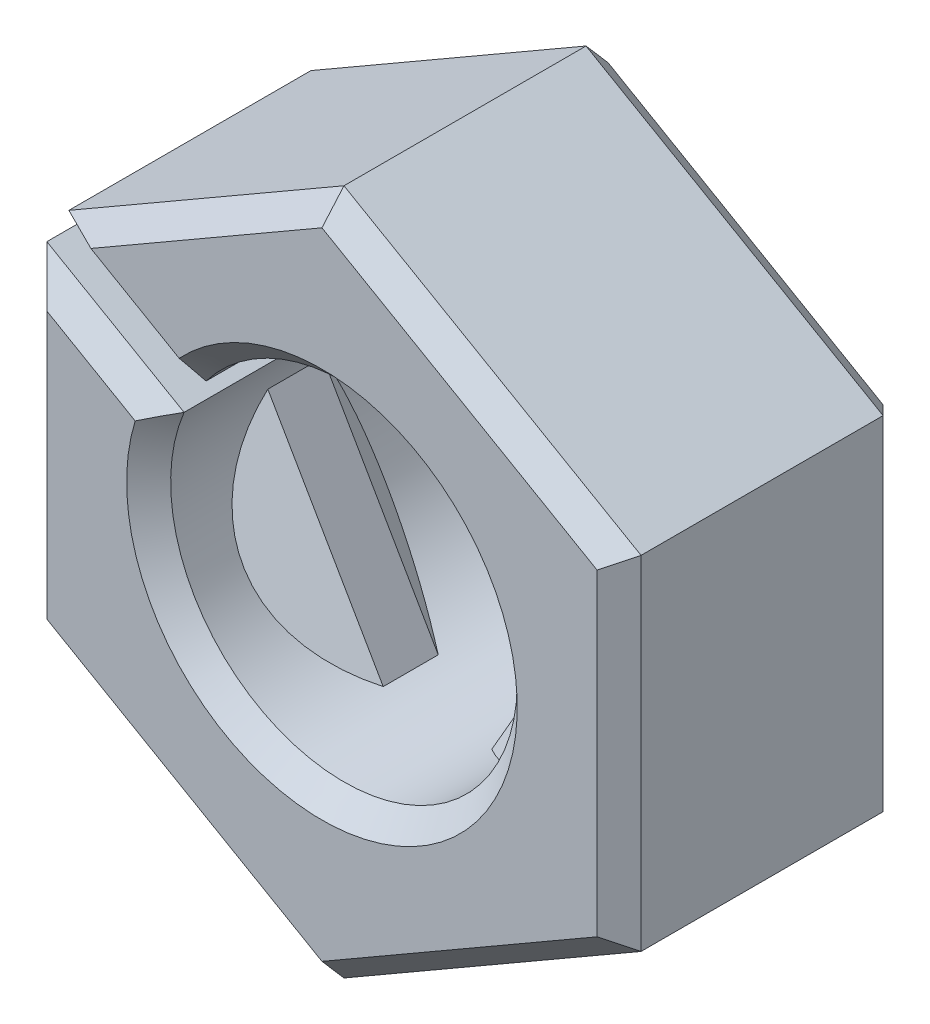
ISO-10303-21;
HEADER;
FILE_DESCRIPTION(('STEP AP214'),'2;1');
FILE_NAME('part.step','',(''),(''),'','','');
FILE_SCHEMA(('AUTOMOTIVE_DESIGN { 1 0 10303 214 1 1 1 1 }'));
ENDSEC;
DATA;
#1=APPLICATION_CONTEXT('core data for automotive mechanical design processes');
#2=APPLICATION_PROTOCOL_DEFINITION('international standard','automotive_design',2000,#1);
#3=PRODUCT_CONTEXT('',#1,'mechanical');
#4=PRODUCT('Part','Part','',(#3));
#5=PRODUCT_RELATED_PRODUCT_CATEGORY('part','',(#4));
#6=PRODUCT_DEFINITION_FORMATION('','',#4);
#7=PRODUCT_DEFINITION_CONTEXT('part definition',#1,'design');
#8=PRODUCT_DEFINITION('design','',#6,#7);
#9=PRODUCT_DEFINITION_SHAPE('','',#8);
#10=(LENGTH_UNIT() NAMED_UNIT(*) SI_UNIT(.MILLI.,.METRE.));
#11=(NAMED_UNIT(*) PLANE_ANGLE_UNIT() SI_UNIT($,.RADIAN.));
#12=(NAMED_UNIT(*) SI_UNIT($,.STERADIAN.) SOLID_ANGLE_UNIT());
#13=UNCERTAINTY_MEASURE_WITH_UNIT(LENGTH_MEASURE(1.E-05),#10,'distance_accuracy_value','');
#14=(GEOMETRIC_REPRESENTATION_CONTEXT(3) GLOBAL_UNCERTAINTY_ASSIGNED_CONTEXT((#13)) GLOBAL_UNIT_ASSIGNED_CONTEXT((#10,
#11,#12)) REPRESENTATION_CONTEXT('',''));
#15=CARTESIAN_POINT('',(0.,0.,0.));
#16=DIRECTION('',(0.,0.,1.));
#17=DIRECTION('',(1.,0.,0.));
#18=AXIS2_PLACEMENT_3D('',#15,#16,#17);
#19=CARTESIAN_POINT('',(0.,3.11769145362398,1.3));
#20=DIRECTION('',(0.5,-0.866025403784439,0.));
#21=DIRECTION('',(0.866025403784439,0.5,0.));
#22=AXIS2_PLACEMENT_3D('',#19,#20,#21);
#23=PLANE('',#22);
#24=DIRECTION('',(0.,0.,-1.));
#25=VECTOR('',#24,1.);
#26=CARTESIAN_POINT('',(0.,3.11769145362398,1.3));
#27=LINE('',#26,#25);
#28=CARTESIAN_POINT('',(0.,3.11769145362398,1.1));
#29=VERTEX_POINT('',#28);
#30=CARTESIAN_POINT('',(0.,3.11769145362398,-1.1));
#31=VERTEX_POINT('',#30);
#32=EDGE_CURVE('E263',#29,#31,#27,.T.);
#33=ORIENTED_EDGE('',*,*,#32,.T.);
#34=DIRECTION('',(-0.866025403784439,-0.5,0.));
#35=VECTOR('',#34,1.);
#36=CARTESIAN_POINT('',(0.,3.11769145362398,-1.1));
#37=LINE('',#36,#35);
#38=CARTESIAN_POINT('',(-2.5,1.67431578064992,-1.1));
#39=VERTEX_POINT('',#38);
#40=EDGE_CURVE('E319',#31,#39,#37,.T.);
#41=ORIENTED_EDGE('',*,*,#40,.T.);
#42=DIRECTION('',(0.,0.,-1.));
#43=VECTOR('',#42,1.);
#44=CARTESIAN_POINT('',(-2.5,1.67431578064992,1.3));
#45=LINE('',#44,#43);
#46=CARTESIAN_POINT('',(-2.5,1.67431578064992,1.1));
#47=VERTEX_POINT('',#46);
#48=EDGE_CURVE('E564',#47,#39,#45,.T.);
#49=ORIENTED_EDGE('',*,*,#48,.F.);
#50=DIRECTION('',(0.866025403784439,0.5,0.));
#51=VECTOR('',#50,1.);
#52=CARTESIAN_POINT('',(0.,3.11769145362398,1.1));
#53=LINE('',#52,#51);
#54=EDGE_CURVE('E317',#47,#29,#53,.T.);
#55=ORIENTED_EDGE('',*,*,#54,.T.);
#56=EDGE_LOOP('',(#33,#41,#49,#55));
#57=FACE_BOUND('',#56,.T.);
#58=ADVANCED_FACE('F41',(#57),#23,.F.);
#59=CARTESIAN_POINT('',(0.,0.,1.3));
#60=DIRECTION('',(0.,0.,1.));
#61=DIRECTION('',(1.,0.,0.));
#62=AXIS2_PLACEMENT_3D('',#59,#60,#61);
#63=PLANE('',#62);
#64=DIRECTION('',(0.866025403784439,-0.5,0.));
#65=VECTOR('',#64,1.);
#66=CARTESIAN_POINT('',(0.2,0.346410161513776,1.3));
#67=LINE('',#66,#65);
#68=CARTESIAN_POINT('',(-2.1,1.67431578064992,1.3));
#69=VERTEX_POINT('',#68);
#70=CARTESIAN_POINT('',(-1.29765441607869,1.21108134178984,1.3));
#71=VERTEX_POINT('',#70);
#72=EDGE_CURVE('E51',#69,#71,#67,.T.);
#73=ORIENTED_EDGE('',*,*,#72,.T.);
#74=CARTESIAN_POINT('',(0.,0.,1.3));
#75=DIRECTION('',(0.,0.,1.));
#76=DIRECTION('',(1.,0.,0.));
#77=AXIS2_PLACEMENT_3D('',#74,#75,#76);
#78=CIRCLE('',#77,1.775);
#79=CARTESIAN_POINT('',(-1.69765441607869,0.518261018762288,1.3));
#80=VERTEX_POINT('',#79);
#81=EDGE_CURVE('E11',#71,#80,#78,.F.);
#82=ORIENTED_EDGE('',*,*,#81,.T.);
#83=DIRECTION('',(-0.866025403784439,0.5,0.));
#84=VECTOR('',#83,1.);
#85=CARTESIAN_POINT('',(-2.8,1.15470053837925,1.3));
#86=LINE('',#85,#84);
#87=CARTESIAN_POINT('',(-2.5,0.981495457622364,1.3));
#88=VERTEX_POINT('',#87);
#89=EDGE_CURVE('E340',#80,#88,#86,.T.);
#90=ORIENTED_EDGE('',*,*,#89,.T.);
#91=DIRECTION('',(0.,-1.,0.));
#92=VECTOR('',#91,1.);
#93=CARTESIAN_POINT('',(-2.5,-1.55884572681199,1.3));
#94=LINE('',#93,#92);
#95=CARTESIAN_POINT('',(-2.5,-1.44337567297407,1.3));
#96=VERTEX_POINT('',#95);
#97=EDGE_CURVE('E339',#88,#96,#94,.T.);
#98=ORIENTED_EDGE('',*,*,#97,.T.);
#99=DIRECTION('',(0.866025403784439,-0.5,0.));
#100=VECTOR('',#99,1.);
#101=CARTESIAN_POINT('',(0.0999999999999997,-2.94448637286709,1.3));
#102=LINE('',#101,#100);
#103=CARTESIAN_POINT('',(0.,-2.88675134594813,1.3));
#104=VERTEX_POINT('',#103);
#105=EDGE_CURVE('E342',#96,#104,#102,.T.);
#106=ORIENTED_EDGE('',*,*,#105,.T.);
#107=DIRECTION('',(0.866025403784439,0.5,0.));
#108=VECTOR('',#107,1.);
#109=CARTESIAN_POINT('',(2.6,-1.3856406460551,1.3));
#110=LINE('',#109,#108);
#111=CARTESIAN_POINT('',(2.5,-1.44337567297407,1.3));
#112=VERTEX_POINT('',#111);
#113=EDGE_CURVE('E344',#104,#112,#110,.T.);
#114=ORIENTED_EDGE('',*,*,#113,.T.);
#115=DIRECTION('',(0.,1.,0.));
#116=VECTOR('',#115,1.);
#117=CARTESIAN_POINT('',(2.5,1.55884572681199,1.3));
#118=LINE('',#117,#116);
#119=CARTESIAN_POINT('',(2.5,1.44337567297407,1.3));
#120=VERTEX_POINT('',#119);
#121=EDGE_CURVE('E343',#112,#120,#118,.T.);
#122=ORIENTED_EDGE('',*,*,#121,.T.);
#123=DIRECTION('',(-0.866025403784439,0.5,0.));
#124=VECTOR('',#123,1.);
#125=CARTESIAN_POINT('',(-0.100000000000001,2.94448637286709,1.3));
#126=LINE('',#125,#124);
#127=CARTESIAN_POINT('',(0.,2.88675134594813,1.3));
#128=VERTEX_POINT('',#127);
#129=EDGE_CURVE('E350',#120,#128,#126,.T.);
#130=ORIENTED_EDGE('',*,*,#129,.T.);
#131=DIRECTION('',(-0.866025403784439,-0.5,0.));
#132=VECTOR('',#131,1.);
#133=CARTESIAN_POINT('',(-2.4,1.50111069989303,1.3));
#134=LINE('',#133,#132);
#135=EDGE_CURVE('E65',#128,#69,#134,.T.);
#136=ORIENTED_EDGE('',*,*,#135,.T.);
#137=EDGE_LOOP('',(#73,#82,#90,#98,#106,#114,#122,#130,#136));
#138=FACE_BOUND('',#137,.T.);
#139=ADVANCED_FACE('F489',(#138),#63,.T.);
#140=CARTESIAN_POINT('',(0.,0.,-1.3));
#141=DIRECTION('',(0.,0.,1.));
#142=DIRECTION('',(1.,0.,0.));
#143=AXIS2_PLACEMENT_3D('',#140,#141,#142);
#144=PLANE('',#143);
#145=DIRECTION('',(-0.866025403784439,-0.5,0.));
#146=VECTOR('',#145,1.);
#147=CARTESIAN_POINT('',(1.25,-2.1650635094611,-1.3));
#148=LINE('',#147,#146);
#149=CARTESIAN_POINT('',(2.5,-1.44337567297407,-1.3));
#150=VERTEX_POINT('',#149);
#151=CARTESIAN_POINT('',(0.,-2.88675134594813,-1.3));
#152=VERTEX_POINT('',#151);
#153=EDGE_CURVE('E299',#150,#152,#148,.T.);
#154=ORIENTED_EDGE('',*,*,#153,.T.);
#155=DIRECTION('',(-0.866025403784439,0.5,0.));
#156=VECTOR('',#155,1.);
#157=CARTESIAN_POINT('',(-1.25,-2.1650635094611,-1.3));
#158=LINE('',#157,#156);
#159=CARTESIAN_POINT('',(-2.5,-1.44337567297407,-1.3));
#160=VERTEX_POINT('',#159);
#161=EDGE_CURVE('E301',#152,#160,#158,.T.);
#162=ORIENTED_EDGE('',*,*,#161,.T.);
#163=DIRECTION('',(0.,1.,0.));
#164=VECTOR('',#163,1.);
#165=CARTESIAN_POINT('',(-2.5,0.,-1.3));
#166=LINE('',#165,#164);
#167=CARTESIAN_POINT('',(-2.5,0.981495457622364,-1.3));
#168=VERTEX_POINT('',#167);
#169=EDGE_CURVE('E284',#160,#168,#166,.T.);
#170=ORIENTED_EDGE('',*,*,#169,.T.);
#171=DIRECTION('',(0.866025403784439,-0.5,0.));
#172=VECTOR('',#171,1.);
#173=CARTESIAN_POINT('',(-0.2,-0.346410161513776,-1.3));
#174=LINE('',#173,#172);
#175=CARTESIAN_POINT('',(-1.69765441607869,0.518261018762288,-1.3));
#176=VERTEX_POINT('',#175);
#177=EDGE_CURVE('E289',#168,#176,#174,.T.);
#178=ORIENTED_EDGE('',*,*,#177,.T.);
#179=CARTESIAN_POINT('',(0.,0.,-1.3));
#180=DIRECTION('',(0.,0.,1.));
#181=DIRECTION('',(1.,0.,0.));
#182=AXIS2_PLACEMENT_3D('',#179,#180,#181);
#183=CIRCLE('',#182,1.775);
#184=CARTESIAN_POINT('',(-1.29765441607869,1.21108134178984,-1.3));
#185=VERTEX_POINT('',#184);
#186=EDGE_CURVE('E286',#176,#185,#183,.T.);
#187=ORIENTED_EDGE('',*,*,#186,.T.);
#188=DIRECTION('',(-0.866025403784439,0.5,0.));
#189=VECTOR('',#188,1.);
#190=CARTESIAN_POINT('',(-2.4,1.8475208614068,-1.3));
#191=LINE('',#190,#189);
#192=CARTESIAN_POINT('',(-2.1,1.67431578064992,-1.3));
#193=VERTEX_POINT('',#192);
#194=EDGE_CURVE('E293',#185,#193,#191,.T.);
#195=ORIENTED_EDGE('',*,*,#194,.T.);
#196=DIRECTION('',(0.866025403784439,0.5,0.));
#197=VECTOR('',#196,1.);
#198=CARTESIAN_POINT('',(-1.25,2.1650635094611,-1.3));
#199=LINE('',#198,#197);
#200=CARTESIAN_POINT('',(0.,2.88675134594813,-1.3));
#201=VERTEX_POINT('',#200);
#202=EDGE_CURVE('E291',#193,#201,#199,.T.);
#203=ORIENTED_EDGE('',*,*,#202,.T.);
#204=DIRECTION('',(0.866025403784439,-0.5,0.));
#205=VECTOR('',#204,1.);
#206=CARTESIAN_POINT('',(1.25,2.1650635094611,-1.3));
#207=LINE('',#206,#205);
#208=CARTESIAN_POINT('',(2.5,1.44337567297407,-1.3));
#209=VERTEX_POINT('',#208);
#210=EDGE_CURVE('E294',#201,#209,#207,.T.);
#211=ORIENTED_EDGE('',*,*,#210,.T.);
#212=DIRECTION('',(0.,-1.,0.));
#213=VECTOR('',#212,1.);
#214=CARTESIAN_POINT('',(2.5,0.,-1.3));
#215=LINE('',#214,#213);
#216=EDGE_CURVE('E300',#209,#150,#215,.T.);
#217=ORIENTED_EDGE('',*,*,#216,.T.);
#218=EDGE_LOOP('',(#154,#162,#170,#178,#187,#195,#203,#211,#217));
#219=FACE_BOUND('',#218,.T.);
#220=ADVANCED_FACE('F500',(#219),#144,.F.);
#221=CARTESIAN_POINT('',(0.,-3.11769145362398,1.3));
#222=DIRECTION('',(-0.5,0.866025403784439,0.));
#223=DIRECTION('',(-0.866025403784439,-0.5,0.));
#224=AXIS2_PLACEMENT_3D('',#221,#222,#223);
#225=PLANE('',#224);
#226=DIRECTION('',(0.,0.,-1.));
#227=VECTOR('',#226,1.);
#228=CARTESIAN_POINT('',(0.,-3.11769145362398,1.3));
#229=LINE('',#228,#227);
#230=CARTESIAN_POINT('',(0.,-3.11769145362398,1.1));
#231=VERTEX_POINT('',#230);
#232=CARTESIAN_POINT('',(0.,-3.11769145362398,-1.1));
#233=VERTEX_POINT('',#232);
#234=EDGE_CURVE('E257',#231,#233,#229,.T.);
#235=ORIENTED_EDGE('',*,*,#234,.T.);
#236=DIRECTION('',(0.866025403784439,0.5,0.));
#237=VECTOR('',#236,1.);
#238=CARTESIAN_POINT('',(0.,-3.11769145362398,-1.1));
#239=LINE('',#238,#237);
#240=CARTESIAN_POINT('',(2.7,-1.55884572681199,-1.1));
#241=VERTEX_POINT('',#240);
#242=EDGE_CURVE('E306',#233,#241,#239,.T.);
#243=ORIENTED_EDGE('',*,*,#242,.T.);
#244=DIRECTION('',(0.,0.,-1.));
#245=VECTOR('',#244,1.);
#246=CARTESIAN_POINT('',(2.7,-1.55884572681199,1.3));
#247=LINE('',#246,#245);
#248=CARTESIAN_POINT('',(2.7,-1.55884572681199,1.1));
#249=VERTEX_POINT('',#248);
#250=EDGE_CURVE('E272',#249,#241,#247,.T.);
#251=ORIENTED_EDGE('',*,*,#250,.F.);
#252=DIRECTION('',(-0.866025403784439,-0.5,0.));
#253=VECTOR('',#252,1.);
#254=CARTESIAN_POINT('',(0.,-3.11769145362398,1.1));
#255=LINE('',#254,#253);
#256=EDGE_CURVE('E302',#249,#231,#255,.T.);
#257=ORIENTED_EDGE('',*,*,#256,.T.);
#258=EDGE_LOOP('',(#235,#243,#251,#257));
#259=FACE_BOUND('',#258,.T.);
#260=ADVANCED_FACE('F509',(#259),#225,.F.);
#261=CARTESIAN_POINT('',(2.7,-1.55884572681199,1.3));
#262=DIRECTION('',(-1.,0.,0.));
#263=DIRECTION('',(0.,-1.,0.));
#264=AXIS2_PLACEMENT_3D('',#261,#262,#263);
#265=PLANE('',#264);
#266=ORIENTED_EDGE('',*,*,#250,.T.);
#267=DIRECTION('',(0.,1.,0.));
#268=VECTOR('',#267,1.);
#269=CARTESIAN_POINT('',(2.7,-1.55884572681199,-1.1));
#270=LINE('',#269,#268);
#271=CARTESIAN_POINT('',(2.7,1.55884572681199,-1.1));
#272=VERTEX_POINT('',#271);
#273=EDGE_CURVE('E309',#241,#272,#270,.T.);
#274=ORIENTED_EDGE('',*,*,#273,.T.);
#275=DIRECTION('',(0.,0.,-1.));
#276=VECTOR('',#275,1.);
#277=CARTESIAN_POINT('',(2.7,1.55884572681199,1.3));
#278=LINE('',#277,#276);
#279=CARTESIAN_POINT('',(2.7,1.55884572681199,1.1));
#280=VERTEX_POINT('',#279);
#281=EDGE_CURVE('E269',#280,#272,#278,.T.);
#282=ORIENTED_EDGE('',*,*,#281,.F.);
#283=DIRECTION('',(0.,-1.,0.));
#284=VECTOR('',#283,1.);
#285=CARTESIAN_POINT('',(2.7,-1.55884572681199,1.1));
#286=LINE('',#285,#284);
#287=EDGE_CURVE('E308',#280,#249,#286,.T.);
#288=ORIENTED_EDGE('',*,*,#287,.T.);
#289=EDGE_LOOP('',(#266,#274,#282,#288));
#290=FACE_BOUND('',#289,.T.);
#291=ADVANCED_FACE('F506',(#290),#265,.F.);
#292=CARTESIAN_POINT('',(2.7,1.55884572681199,1.3));
#293=DIRECTION('',(-0.5,-0.866025403784439,0.));
#294=DIRECTION('',(0.866025403784439,-0.5,0.));
#295=AXIS2_PLACEMENT_3D('',#292,#293,#294);
#296=PLANE('',#295);
#297=ORIENTED_EDGE('',*,*,#281,.T.);
#298=DIRECTION('',(-0.866025403784439,0.5,0.));
#299=VECTOR('',#298,1.);
#300=CARTESIAN_POINT('',(2.7,1.55884572681199,-1.1));
#301=LINE('',#300,#299);
#302=EDGE_CURVE('E313',#272,#31,#301,.T.);
#303=ORIENTED_EDGE('',*,*,#302,.T.);
#304=ORIENTED_EDGE('',*,*,#32,.F.);
#305=DIRECTION('',(0.866025403784439,-0.5,0.));
#306=VECTOR('',#305,1.);
#307=CARTESIAN_POINT('',(2.7,1.55884572681199,1.1));
#308=LINE('',#307,#306);
#309=EDGE_CURVE('E315',#29,#280,#308,.T.);
#310=ORIENTED_EDGE('',*,*,#309,.T.);
#311=EDGE_LOOP('',(#297,#303,#304,#310));
#312=FACE_BOUND('',#311,.T.);
#313=ADVANCED_FACE('F503',(#312),#296,.F.);
#314=CARTESIAN_POINT('',(-2.7,1.55884572681199,1.3));
#315=DIRECTION('',(1.,0.,0.));
#316=DIRECTION('',(0.,0.,-1.));
#317=AXIS2_PLACEMENT_3D('',#314,#315,#316);
#318=PLANE('',#317);
#319=DIRECTION('',(0.,0.,-1.));
#320=VECTOR('',#319,1.);
#321=CARTESIAN_POINT('',(-2.7,1.32790561913614,1.3));
#322=LINE('',#321,#320);
#323=CARTESIAN_POINT('',(-2.7,1.32790561913614,1.1));
#324=VERTEX_POINT('',#323);
#325=CARTESIAN_POINT('',(-2.7,1.32790561913614,-1.1));
#326=VERTEX_POINT('',#325);
#327=EDGE_CURVE('E566',#324,#326,#322,.T.);
#328=ORIENTED_EDGE('',*,*,#327,.T.);
#329=DIRECTION('',(0.,-1.,0.));
#330=VECTOR('',#329,1.);
#331=CARTESIAN_POINT('',(-2.7,1.55884572681199,-1.1));
#332=LINE('',#331,#330);
#333=CARTESIAN_POINT('',(-2.7,-1.55884572681199,-1.1));
#334=VERTEX_POINT('',#333);
#335=EDGE_CURVE('E335',#326,#334,#332,.T.);
#336=ORIENTED_EDGE('',*,*,#335,.T.);
#337=DIRECTION('',(0.,0.,-1.));
#338=VECTOR('',#337,1.);
#339=CARTESIAN_POINT('',(-2.7,-1.55884572681199,1.3));
#340=LINE('',#339,#338);
#341=CARTESIAN_POINT('',(-2.7,-1.55884572681199,1.1));
#342=VERTEX_POINT('',#341);
#343=EDGE_CURVE('E265',#342,#334,#340,.T.);
#344=ORIENTED_EDGE('',*,*,#343,.F.);
#345=DIRECTION('',(0.,1.,0.));
#346=VECTOR('',#345,1.);
#347=CARTESIAN_POINT('',(-2.7,1.32790561913614,1.1));
#348=LINE('',#347,#346);
#349=EDGE_CURVE('E334',#342,#324,#348,.T.);
#350=ORIENTED_EDGE('',*,*,#349,.T.);
#351=EDGE_LOOP('',(#328,#336,#344,#350));
#352=FACE_BOUND('',#351,.T.);
#353=ADVANCED_FACE('F501',(#352),#318,.F.);
#354=CARTESIAN_POINT('',(-2.7,-1.55884572681199,1.3));
#355=DIRECTION('',(0.5,0.866025403784439,0.));
#356=DIRECTION('',(-0.866025403784439,0.5,0.));
#357=AXIS2_PLACEMENT_3D('',#354,#355,#356);
#358=PLANE('',#357);
#359=ORIENTED_EDGE('',*,*,#343,.T.);
#360=DIRECTION('',(0.866025403784439,-0.5,0.));
#361=VECTOR('',#360,1.);
#362=CARTESIAN_POINT('',(-2.7,-1.55884572681199,-1.1));
#363=LINE('',#362,#361);
#364=EDGE_CURVE('E285',#334,#233,#363,.T.);
#365=ORIENTED_EDGE('',*,*,#364,.T.);
#366=ORIENTED_EDGE('',*,*,#234,.F.);
#367=DIRECTION('',(-0.866025403784439,0.5,0.));
#368=VECTOR('',#367,1.);
#369=CARTESIAN_POINT('',(-2.7,-1.55884572681199,1.1));
#370=LINE('',#369,#368);
#371=EDGE_CURVE('E278',#231,#342,#370,.T.);
#372=ORIENTED_EDGE('',*,*,#371,.T.);
#373=EDGE_LOOP('',(#359,#365,#366,#372));
#374=FACE_BOUND('',#373,.T.);
#375=ADVANCED_FACE('F589',(#374),#358,.F.);
#376=CARTESIAN_POINT('',(0.,0.,1.3));
#377=DIRECTION('',(0.,0.,-1.));
#378=DIRECTION('',(-1.,0.,0.));
#379=AXIS2_PLACEMENT_3D('',#376,#377,#378);
#380=CYLINDRICAL_SURFACE('',#379,1.575);
#381=DIRECTION('',(0.,0.,-1.));
#382=VECTOR('',#381,1.);
#383=CARTESIAN_POINT('',(-1.25294816973896,0.954330070755288,1.3));
#384=LINE('',#383,#382);
#385=CARTESIAN_POINT('',(-1.25294816973896,0.954330070755288,1.1));
#386=VERTEX_POINT('',#385);
#387=CARTESIAN_POINT('',(-1.25294816973896,0.954330070755288,-1.1));
#388=VERTEX_POINT('',#387);
#389=EDGE_CURVE('E274',#386,#388,#384,.T.);
#390=ORIENTED_EDGE('',*,*,#389,.T.);
#391=CARTESIAN_POINT('',(0.,0.,-1.1));
#392=DIRECTION('',(0.,0.,1.));
#393=DIRECTION('',(1.,0.,0.));
#394=AXIS2_PLACEMENT_3D('',#391,#392,#393);
#395=CIRCLE('',#394,1.575);
#396=CARTESIAN_POINT('',(-1.45294816973896,0.607919909241512,-1.1));
#397=VERTEX_POINT('',#396);
#398=EDGE_CURVE('E330',#388,#397,#395,.F.);
#399=ORIENTED_EDGE('',*,*,#398,.T.);
#400=DIRECTION('',(0.,0.,-1.));
#401=VECTOR('',#400,1.);
#402=CARTESIAN_POINT('',(-1.45294816973896,0.607919909241512,1.3));
#403=LINE('',#402,#401);
#404=CARTESIAN_POINT('',(-1.45294816973896,0.607919909241512,1.1));
#405=VERTEX_POINT('',#404);
#406=EDGE_CURVE('E280',#405,#397,#403,.T.);
#407=ORIENTED_EDGE('',*,*,#406,.F.);
#408=CARTESIAN_POINT('',(0.,0.,1.1));
#409=DIRECTION('',(0.,0.,1.));
#410=DIRECTION('',(1.,0.,0.));
#411=AXIS2_PLACEMENT_3D('',#408,#409,#410);
#412=CIRCLE('',#411,1.575);
#413=EDGE_CURVE('E321',#405,#386,#412,.T.);
#414=ORIENTED_EDGE('',*,*,#413,.T.);
#415=EDGE_LOOP('',(#390,#399,#407,#414));
#416=FACE_BOUND('',#415,.T.);
#417=CARTESIAN_POINT('',(0.,0.,0.924999999999998));
#418=DIRECTION('',(-0.612372435695797,0.353553390593268,-0.707106781186548));
#419=DIRECTION('',(0.612372435695798,-0.353553390593268,-0.707106781186547));
#420=AXIS2_PLACEMENT_3D('',#417,#418,#419);
#421=ELLIPSE('',#420,2.22738636073762,1.575);
#422=CARTESIAN_POINT('',(0.493175425361654,-1.49579510622924,-0.25));
#423=VERTEX_POINT('',#422);
#424=CARTESIAN_POINT('',(1.54198427353179,0.320795106229261,-0.25));
#425=VERTEX_POINT('',#424);
#426=EDGE_CURVE('E209',#423,#425,#421,.F.);
#427=ORIENTED_EDGE('',*,*,#426,.T.);
#428=DIRECTION('',(0.,0.,-1.));
#429=VECTOR('',#428,1.);
#430=CARTESIAN_POINT('',(1.54198427353179,0.320795106229261,1.3));
#431=LINE('',#430,#429);
#432=CARTESIAN_POINT('',(1.54198427353179,0.320795106229261,0.25));
#433=VERTEX_POINT('',#432);
#434=EDGE_CURVE('E202',#425,#433,#431,.F.);
#435=ORIENTED_EDGE('',*,*,#434,.T.);
#436=CARTESIAN_POINT('',(0.,0.,-0.924999999999998));
#437=DIRECTION('',(-0.612372435695797,0.353553390593268,0.707106781186548));
#438=DIRECTION('',(-0.612372435695798,0.353553390593268,-0.707106781186547));
#439=AXIS2_PLACEMENT_3D('',#436,#437,#438);
#440=ELLIPSE('',#439,2.22738636073762,1.575);
#441=CARTESIAN_POINT('',(0.493175425361654,-1.49579510622924,0.25));
#442=VERTEX_POINT('',#441);
#443=EDGE_CURVE('E207',#433,#442,#440,.F.);
#444=ORIENTED_EDGE('',*,*,#443,.T.);
#445=DIRECTION('',(0.,0.,-1.));
#446=VECTOR('',#445,1.);
#447=CARTESIAN_POINT('',(0.493175425361653,-1.49579510622924,1.3));
#448=LINE('',#447,#446);
#449=EDGE_CURVE('E222',#423,#442,#448,.F.);
#450=ORIENTED_EDGE('',*,*,#449,.F.);
#451=EDGE_LOOP('',(#427,#435,#444,#450));
#452=FACE_BOUND('',#451,.T.);
#453=CARTESIAN_POINT('',(0.,0.,0.924999999999998));
#454=DIRECTION('',(0.612372435695792,0.353553390593276,-0.707106781186548));
#455=DIRECTION('',(-0.612372435695794,-0.353553390593277,-0.707106781186547));
#456=AXIS2_PLACEMENT_3D('',#453,#454,#455);
#457=ELLIPSE('',#456,2.22738636073762,1.575);
#458=CARTESIAN_POINT('',(-1.54198427353179,0.32079510622924,-0.25));
#459=VERTEX_POINT('',#458);
#460=CARTESIAN_POINT('',(-0.493175425361633,-1.49579510622925,-0.25));
#461=VERTEX_POINT('',#460);
#462=EDGE_CURVE('E237',#459,#461,#457,.F.);
#463=ORIENTED_EDGE('',*,*,#462,.T.);
#464=DIRECTION('',(0.,0.,-1.));
#465=VECTOR('',#464,1.);
#466=CARTESIAN_POINT('',(-0.493175425361633,-1.49579510622925,1.3));
#467=LINE('',#466,#465);
#468=CARTESIAN_POINT('',(-0.493175425361634,-1.49579510622925,0.25));
#469=VERTEX_POINT('',#468);
#470=EDGE_CURVE('E245',#461,#469,#467,.F.);
#471=ORIENTED_EDGE('',*,*,#470,.T.);
#472=CARTESIAN_POINT('',(0.,0.,-0.924999999999998));
#473=DIRECTION('',(0.612372435695792,0.353553390593276,0.707106781186548));
#474=DIRECTION('',(0.612372435695794,0.353553390593277,-0.707106781186547));
#475=AXIS2_PLACEMENT_3D('',#472,#473,#474);
#476=ELLIPSE('',#475,2.22738636073762,1.575);
#477=CARTESIAN_POINT('',(-1.54198427353179,0.320795106229239,0.25));
#478=VERTEX_POINT('',#477);
#479=EDGE_CURVE('E236',#469,#478,#476,.F.);
#480=ORIENTED_EDGE('',*,*,#479,.T.);
#481=DIRECTION('',(0.,0.,-1.));
#482=VECTOR('',#481,1.);
#483=CARTESIAN_POINT('',(-1.54198427353179,0.32079510622924,1.3));
#484=LINE('',#483,#482);
#485=EDGE_CURVE('E226',#459,#478,#484,.F.);
#486=ORIENTED_EDGE('',*,*,#485,.F.);
#487=EDGE_LOOP('',(#463,#471,#480,#486));
#488=FACE_BOUND('',#487,.T.);
#489=CARTESIAN_POINT('',(0.,0.,0.924999999999998));
#490=DIRECTION('',(0.,-0.707106781186547,-0.707106781186548));
#491=DIRECTION('',(0.,0.707106781186548,-0.707106781186547));
#492=AXIS2_PLACEMENT_3D('',#489,#490,#491);
#493=ELLIPSE('',#492,2.22738636073762,1.575);
#494=CARTESIAN_POINT('',(1.04880884817015,1.175,-0.25));
#495=VERTEX_POINT('',#494);
#496=CARTESIAN_POINT('',(-1.04880884817015,1.175,-0.25));
#497=VERTEX_POINT('',#496);
#498=EDGE_CURVE('E251',#495,#497,#493,.F.);
#499=ORIENTED_EDGE('',*,*,#498,.T.);
#500=DIRECTION('',(0.,0.,-1.));
#501=VECTOR('',#500,1.);
#502=CARTESIAN_POINT('',(-1.04880884817015,1.175,1.3));
#503=LINE('',#502,#501);
#504=CARTESIAN_POINT('',(-1.04880884817015,1.175,0.25));
#505=VERTEX_POINT('',#504);
#506=EDGE_CURVE('E260',#497,#505,#503,.F.);
#507=ORIENTED_EDGE('',*,*,#506,.T.);
#508=CARTESIAN_POINT('',(0.,0.,-0.924999999999998));
#509=DIRECTION('',(0.,-0.707106781186547,0.707106781186548));
#510=DIRECTION('',(0.,-0.707106781186548,-0.707106781186547));
#511=AXIS2_PLACEMENT_3D('',#508,#509,#510);
#512=ELLIPSE('',#511,2.22738636073762,1.575);
#513=CARTESIAN_POINT('',(1.04880884817015,1.175,0.25));
#514=VERTEX_POINT('',#513);
#515=EDGE_CURVE('E252',#505,#514,#512,.F.);
#516=ORIENTED_EDGE('',*,*,#515,.T.);
#517=DIRECTION('',(0.,0.,-1.));
#518=VECTOR('',#517,1.);
#519=CARTESIAN_POINT('',(1.04880884817015,1.175,1.3));
#520=LINE('',#519,#518);
#521=EDGE_CURVE('E241',#495,#514,#520,.F.);
#522=ORIENTED_EDGE('',*,*,#521,.F.);
#523=EDGE_LOOP('',(#499,#507,#516,#522));
#524=FACE_BOUND('',#523,.T.);
#525=ADVANCED_FACE('F203',(#416,#452,#488,#524),#380,.F.);
#526=CARTESIAN_POINT('',(-2.702,1.575,-0.649999999999999));
#527=DIRECTION('',(0.,-0.707106781186547,-0.707106781186548));
#528=DIRECTION('',(0.,0.707106781186548,-0.707106781186547));
#529=AXIS2_PLACEMENT_3D('',#526,#527,#528);
#530=PLANE('',#529);
#531=ORIENTED_EDGE('',*,*,#498,.F.);
#532=DIRECTION('',(1.,0.,0.));
#533=VECTOR('',#532,1.);
#534=CARTESIAN_POINT('',(-2.702,1.175,-0.25));
#535=LINE('',#534,#533);
#536=EDGE_CURVE('E250',#497,#495,#535,.T.);
#537=ORIENTED_EDGE('',*,*,#536,.F.);
#538=EDGE_LOOP('',(#531,#537));
#539=FACE_BOUND('',#538,.T.);
#540=ADVANCED_FACE('F651',(#539),#530,.T.);
#541=CARTESIAN_POINT('',(-2.702,1.175,-0.25));
#542=DIRECTION('',(0.,-1.,0.));
#543=DIRECTION('',(0.,0.,-1.));
#544=AXIS2_PLACEMENT_3D('',#541,#542,#543);
#545=PLANE('',#544);
#546=ORIENTED_EDGE('',*,*,#506,.F.);
#547=ORIENTED_EDGE('',*,*,#536,.T.);
#548=ORIENTED_EDGE('',*,*,#521,.T.);
#549=DIRECTION('',(1.,0.,0.));
#550=VECTOR('',#549,1.);
#551=CARTESIAN_POINT('',(-2.702,1.175,0.25));
#552=LINE('',#551,#550);
#553=EDGE_CURVE('E247',#505,#514,#552,.T.);
#554=ORIENTED_EDGE('',*,*,#553,.F.);
#555=EDGE_LOOP('',(#546,#547,#548,#554));
#556=FACE_BOUND('',#555,.T.);
#557=ADVANCED_FACE('F661',(#556),#545,.T.);
#558=CARTESIAN_POINT('',(-2.702,1.175,0.25));
#559=DIRECTION('',(0.,-0.707106781186547,0.707106781186548));
#560=DIRECTION('',(0.,-0.707106781186548,-0.707106781186547));
#561=AXIS2_PLACEMENT_3D('',#558,#559,#560);
#562=PLANE('',#561);
#563=ORIENTED_EDGE('',*,*,#515,.F.);
#564=ORIENTED_EDGE('',*,*,#553,.T.);
#565=EDGE_LOOP('',(#563,#564));
#566=FACE_BOUND('',#565,.T.);
#567=ADVANCED_FACE('F660',(#566),#562,.T.);
#568=CARTESIAN_POINT('',(-0.0129900109604728,-3.12750064102556,-0.649999999999999));
#569=DIRECTION('',(0.612372435695792,0.353553390593276,-0.707106781186548));
#570=DIRECTION('',(-0.755928946018456,0.,-0.654653670707975));
#571=AXIS2_PLACEMENT_3D('',#568,#569,#570);
#572=PLANE('',#571);
#573=ORIENTED_EDGE('',*,*,#462,.F.);
#574=DIRECTION('',(-0.500000000000004,0.866025403784436,0.));
#575=VECTOR('',#574,1.);
#576=CARTESIAN_POINT('',(0.333420150553302,-2.92750064102556,-0.25));
#577=LINE('',#576,#575);
#578=EDGE_CURVE('E235',#461,#459,#577,.T.);
#579=ORIENTED_EDGE('',*,*,#578,.F.);
#580=EDGE_LOOP('',(#573,#579));
#581=FACE_BOUND('',#580,.T.);
#582=ADVANCED_FACE('F642',(#581),#572,.T.);
#583=CARTESIAN_POINT('',(0.333420150553302,-2.92750064102556,-0.25));
#584=DIRECTION('',(0.866025403784436,0.500000000000004,0.));
#585=DIRECTION('',(-0.500000000000004,0.866025403784436,0.));
#586=AXIS2_PLACEMENT_3D('',#583,#584,#585);
#587=PLANE('',#586);
#588=ORIENTED_EDGE('',*,*,#470,.F.);
#589=ORIENTED_EDGE('',*,*,#578,.T.);
#590=ORIENTED_EDGE('',*,*,#485,.T.);
#591=DIRECTION('',(-0.500000000000004,0.866025403784436,0.));
#592=VECTOR('',#591,1.);
#593=CARTESIAN_POINT('',(0.333420150553302,-2.92750064102556,0.25));
#594=LINE('',#593,#592);
#595=EDGE_CURVE('E231',#469,#478,#594,.T.);
#596=ORIENTED_EDGE('',*,*,#595,.F.);
#597=EDGE_LOOP('',(#588,#589,#590,#596));
#598=FACE_BOUND('',#597,.T.);
#599=ADVANCED_FACE('F652',(#598),#587,.T.);
#600=CARTESIAN_POINT('',(0.333420150553302,-2.92750064102556,0.25));
#601=DIRECTION('',(0.612372435695792,0.353553390593276,0.707106781186548));
#602=DIRECTION('',(0.755928946018456,0.,-0.654653670707975));
#603=AXIS2_PLACEMENT_3D('',#600,#601,#602);
#604=PLANE('',#603);
#605=ORIENTED_EDGE('',*,*,#479,.F.);
#606=ORIENTED_EDGE('',*,*,#595,.T.);
#607=EDGE_LOOP('',(#605,#606));
#608=FACE_BOUND('',#607,.T.);
#609=ADVANCED_FACE('F644',(#608),#604,.T.);
#610=CARTESIAN_POINT('',(2.71499001096048,1.55250064102559,-0.649999999999999));
#611=DIRECTION('',(-0.612372435695797,0.353553390593268,-0.707106781186548));
#612=DIRECTION('',(-0.755928946018453,0.,0.654653670707978));
#613=AXIS2_PLACEMENT_3D('',#610,#611,#612);
#614=PLANE('',#613);
#615=ORIENTED_EDGE('',*,*,#426,.F.);
#616=DIRECTION('',(-0.499999999999992,-0.866025403784443,0.));
#617=VECTOR('',#616,1.);
#618=CARTESIAN_POINT('',(2.36857984944671,1.75250064102559,-0.25));
#619=LINE('',#618,#617);
#620=EDGE_CURVE('E224',#425,#423,#619,.T.);
#621=ORIENTED_EDGE('',*,*,#620,.F.);
#622=EDGE_LOOP('',(#615,#621));
#623=FACE_BOUND('',#622,.T.);
#624=ADVANCED_FACE('F632',(#623),#614,.T.);
#625=CARTESIAN_POINT('',(2.36857984944671,1.75250064102559,-0.25));
#626=DIRECTION('',(-0.866025403784443,0.499999999999992,0.));
#627=DIRECTION('',(-0.499999999999992,-0.866025403784443,0.));
#628=AXIS2_PLACEMENT_3D('',#625,#626,#627);
#629=PLANE('',#628);
#630=ORIENTED_EDGE('',*,*,#434,.F.);
#631=ORIENTED_EDGE('',*,*,#620,.T.);
#632=ORIENTED_EDGE('',*,*,#449,.T.);
#633=DIRECTION('',(-0.499999999999992,-0.866025403784443,0.));
#634=VECTOR('',#633,1.);
#635=CARTESIAN_POINT('',(2.36857984944671,1.75250064102559,0.25));
#636=LINE('',#635,#634);
#637=EDGE_CURVE('E220',#433,#442,#636,.T.);
#638=ORIENTED_EDGE('',*,*,#637,.F.);
#639=EDGE_LOOP('',(#630,#631,#632,#638));
#640=FACE_BOUND('',#639,.T.);
#641=ADVANCED_FACE('F219',(#640),#629,.T.);
#642=CARTESIAN_POINT('',(2.36857984944671,1.75250064102559,0.25));
#643=DIRECTION('',(-0.612372435695797,0.353553390593268,0.707106781186548));
#644=DIRECTION('',(0.755928946018453,0.,0.654653670707978));
#645=AXIS2_PLACEMENT_3D('',#642,#643,#644);
#646=PLANE('',#645);
#647=ORIENTED_EDGE('',*,*,#443,.F.);
#648=ORIENTED_EDGE('',*,*,#637,.T.);
#649=EDGE_LOOP('',(#647,#648));
#650=FACE_BOUND('',#649,.T.);
#651=ADVANCED_FACE('F216',(#650),#646,.T.);
#652=CARTESIAN_POINT('',(-2.6,1.73205080756888,-1.3));
#653=DIRECTION('',(-0.5,-0.866025403784439,0.));
#654=DIRECTION('',(0.866025403784439,-0.5,0.));
#655=AXIS2_PLACEMENT_3D('',#652,#653,#654);
#656=PLANE('',#655);
#657=ORIENTED_EDGE('',*,*,#48,.T.);
#658=DIRECTION('',(0.866025403784439,-0.5,0.));
#659=VECTOR('',#658,1.);
#660=CARTESIAN_POINT('',(-1.25294816973896,0.954330070755288,-1.1));
#661=LINE('',#660,#659);
#662=EDGE_CURVE('E325',#39,#388,#661,.T.);
#663=ORIENTED_EDGE('',*,*,#662,.T.);
#664=ORIENTED_EDGE('',*,*,#389,.F.);
#665=DIRECTION('',(-0.866025403784439,0.5,0.));
#666=VECTOR('',#665,1.);
#667=CARTESIAN_POINT('',(-2.6,1.73205080756888,1.1));
#668=LINE('',#667,#666);
#669=EDGE_CURVE('E318',#386,#47,#668,.T.);
#670=ORIENTED_EDGE('',*,*,#669,.T.);
#671=EDGE_LOOP('',(#657,#663,#664,#670));
#672=FACE_BOUND('',#671,.T.);
#673=ADVANCED_FACE('F631',(#672),#656,.T.);
#674=CARTESIAN_POINT('',(-2.8,1.3856406460551,-1.3));
#675=DIRECTION('',(-0.5,-0.866025403784439,0.));
#676=DIRECTION('',(0.866025403784439,-0.5,0.));
#677=AXIS2_PLACEMENT_3D('',#674,#675,#676);
#678=PLANE('',#677);
#679=ORIENTED_EDGE('',*,*,#406,.T.);
#680=DIRECTION('',(-0.866025403784439,0.5,0.));
#681=VECTOR('',#680,1.);
#682=CARTESIAN_POINT('',(-2.8,1.3856406460551,-1.1));
#683=LINE('',#682,#681);
#684=EDGE_CURVE('E331',#397,#326,#683,.T.);
#685=ORIENTED_EDGE('',*,*,#684,.T.);
#686=ORIENTED_EDGE('',*,*,#327,.F.);
#687=DIRECTION('',(0.866025403784439,-0.5,0.));
#688=VECTOR('',#687,1.);
#689=CARTESIAN_POINT('',(-1.45294816973896,0.607919909241512,1.1));
#690=LINE('',#689,#688);
#691=EDGE_CURVE('E326',#324,#405,#690,.T.);
#692=ORIENTED_EDGE('',*,*,#691,.T.);
#693=EDGE_LOOP('',(#679,#685,#686,#692));
#694=FACE_BOUND('',#693,.T.);
#695=ADVANCED_FACE('F406',(#694),#678,.F.);
#696=CARTESIAN_POINT('',(-2.6,1.73205080756888,-1.1));
#697=DIRECTION('',(-0.353553390593273,-0.612372435695793,-0.707106781186549));
#698=DIRECTION('',(-0.866025403784439,0.5,0.));
#699=AXIS2_PLACEMENT_3D('',#696,#697,#698);
#700=PLANE('',#699);
#701=CARTESIAN_POINT('',(-1.25294816973896,0.954330070755288,-1.1));
#702=CARTESIAN_POINT('',(-1.25725821042162,0.975798924764101,-1.11643755262044));
#703=CARTESIAN_POINT('',(-1.26141141279439,0.997250431525416,-1.13293850123881));
#704=CARTESIAN_POINT('',(-1.26942003277153,1.04011529669311,-1.16605625341526));
#705=CARTESIAN_POINT('',(-1.27327548709253,1.06152865948402,-1.18267304241214));
#706=CARTESIAN_POINT('',(-1.28070549164418,1.10431869635096,-1.21601529909196));
#707=CARTESIAN_POINT('',(-1.28428004699683,1.12569537108902,-1.23274076478723));
#708=CARTESIAN_POINT('',(-1.29116322162157,1.16841466424594,-1.26629517058047));
#709=CARTESIAN_POINT('',(-1.29447180799432,1.18975727813256,-1.28312412320306));
#710=CARTESIAN_POINT('',(-1.29765441608011,1.21108134179,-1.29999999999943));
#711=B_SPLINE_CURVE_WITH_KNOTS('',3,(#701,#702,#703,#704,#705,#706,#707,#708,#709,#710),
.UNSPECIFIED.,.F.,.F.,(4,2,2,2,4),(0.,0.0821400634587662,0.164269981639807,0.246398401892578,
0.328536965534299),.UNSPECIFIED.);
#712=EDGE_CURVE('E395',#388,#185,#711,.T.);
#713=ORIENTED_EDGE('',*,*,#712,.F.);
#714=ORIENTED_EDGE('',*,*,#662,.F.);
#715=DIRECTION('',(-0.894427190999917,0.,0.447213595499957));
#716=VECTOR('',#715,1.);
#717=CARTESIAN_POINT('',(-2.58,1.67431578064992,-1.06));
#718=LINE('',#717,#716);
#719=EDGE_CURVE('E398',#193,#39,#718,.T.);
#720=ORIENTED_EDGE('',*,*,#719,.F.);
#721=ORIENTED_EDGE('',*,*,#194,.F.);
#722=EDGE_LOOP('',(#713,#714,#720,#721));
#723=FACE_BOUND('',#722,.T.);
#724=ADVANCED_FACE('F405',(#723),#700,.T.);
#725=CARTESIAN_POINT('',(0.,3.11769145362398,-1.1));
#726=DIRECTION('',(0.353553390593273,-0.612372435695793,0.707106781186549));
#727=DIRECTION('',(-0.866025403784439,-0.5,0.));
#728=AXIS2_PLACEMENT_3D('',#725,#726,#727);
#729=PLANE('',#728);
#730=ORIENTED_EDGE('',*,*,#719,.T.);
#731=ORIENTED_EDGE('',*,*,#40,.F.);
#732=DIRECTION('',(0.,-0.755928946018456,-0.654653670707975));
#733=VECTOR('',#732,1.);
#734=CARTESIAN_POINT('',(0.,3.11769145362398,-1.1));
#735=LINE('',#734,#733);
#736=EDGE_CURVE('E373',#201,#31,#735,.F.);
#737=ORIENTED_EDGE('',*,*,#736,.F.);
#738=ORIENTED_EDGE('',*,*,#202,.F.);
#739=EDGE_LOOP('',(#730,#731,#737,#738));
#740=FACE_BOUND('',#739,.T.);
#741=ADVANCED_FACE('F389',(#740),#729,.F.);
#742=CARTESIAN_POINT('',(0.,0.,-1.3));
#743=DIRECTION('',(0.,0.,-1.));
#744=DIRECTION('',(-1.,0.,0.));
#745=AXIS2_PLACEMENT_3D('',#742,#743,#744);
#746=CONICAL_SURFACE('',#745,1.775,0.78539816339745);
#747=ORIENTED_EDGE('',*,*,#712,.T.);
#748=ORIENTED_EDGE('',*,*,#186,.F.);
#749=CARTESIAN_POINT('',(-1.45294816973896,0.607919909241512,-1.1));
#750=CARTESIAN_POINT('',(-1.47369576304206,0.600918086959634,-1.11643755262044));
#751=CARTESIAN_POINT('',(-1.49434991403319,0.593789112340849,-1.13293850123881));
#752=CARTESIAN_POINT('',(-1.53547628618679,0.579292348106467,-1.16605625341525));
#753=CARTESIAN_POINT('',(-1.55594852950466,0.571924588096125,-1.18267304241214));
#754=CARTESIAN_POINT('',(-1.59672079073613,0.556964142354621,-1.21601529909195));
#755=CARTESIAN_POINT('',(-1.61702081178405,0.549371460728221,-1.23274076478722));
#756=CARTESIAN_POINT('',(-1.65745839220203,0.533972818233472,-1.26629517058046));
#757=CARTESIAN_POINT('',(-1.67759593119737,0.526166831139578,-1.28312412320306));
#758=CARTESIAN_POINT('',(-1.69765441607953,0.518261018763438,-1.29999999999942));
#759=B_SPLINE_CURVE_WITH_KNOTS('',3,(#749,#750,#751,#752,#753,#754,#755,#756,#757,#758),
.UNSPECIFIED.,.F.,.F.,(4,2,2,2,4),(0.,0.0821400634587629,0.1642699816398,0.246398401892568,
0.328536965534287),.UNSPECIFIED.);
#760=EDGE_CURVE('E364',#397,#176,#759,.T.);
#761=ORIENTED_EDGE('',*,*,#760,.F.);
#762=ORIENTED_EDGE('',*,*,#398,.F.);
#763=EDGE_LOOP('',(#747,#748,#761,#762));
#764=FACE_BOUND('',#763,.T.);
#765=ADVANCED_FACE('F379',(#764),#746,.F.);
#766=CARTESIAN_POINT('',(2.7,1.55884572681199,-1.1));
#767=DIRECTION('',(-0.353553390593273,-0.612372435695793,0.707106781186549));
#768=DIRECTION('',(-0.866025403784439,0.5,0.));
#769=AXIS2_PLACEMENT_3D('',#766,#767,#768);
#770=PLANE('',#769);
#771=ORIENTED_EDGE('',*,*,#736,.T.);
#772=ORIENTED_EDGE('',*,*,#302,.F.);
#773=DIRECTION('',(-0.654653670707978,-0.377964473009229,-0.654653670707975));
#774=VECTOR('',#773,1.);
#775=CARTESIAN_POINT('',(2.7,1.55884572681199,-1.1));
#776=LINE('',#775,#774);
#777=EDGE_CURVE('E363',#209,#272,#776,.F.);
#778=ORIENTED_EDGE('',*,*,#777,.F.);
#779=ORIENTED_EDGE('',*,*,#210,.F.);
#780=EDGE_LOOP('',(#771,#772,#778,#779));
#781=FACE_BOUND('',#780,.T.);
#782=ADVANCED_FACE('F390',(#781),#770,.F.);
#783=CARTESIAN_POINT('',(-0.2,-0.346410161513776,-1.3));
#784=DIRECTION('',(-0.353553390593273,-0.612372435695793,0.707106781186549));
#785=DIRECTION('',(0.866025403784439,-0.5,0.));
#786=AXIS2_PLACEMENT_3D('',#783,#784,#785);
#787=PLANE('',#786);
#788=ORIENTED_EDGE('',*,*,#760,.T.);
#789=ORIENTED_EDGE('',*,*,#177,.F.);
#790=DIRECTION('',(0.447213595499958,-0.774596669241484,-0.447213595499956));
#791=VECTOR('',#790,1.);
#792=CARTESIAN_POINT('',(-2.78,1.46646968374165,-1.02));
#793=LINE('',#792,#791);
#794=EDGE_CURVE('E356',#326,#168,#793,.T.);
#795=ORIENTED_EDGE('',*,*,#794,.F.);
#796=ORIENTED_EDGE('',*,*,#684,.F.);
#797=EDGE_LOOP('',(#788,#789,#795,#796));
#798=FACE_BOUND('',#797,.T.);
#799=ADVANCED_FACE('F376',(#798),#787,.F.);
#800=CARTESIAN_POINT('',(2.7,-1.55884572681199,-1.1));
#801=DIRECTION('',(-0.707106781186546,0.,0.707106781186549));
#802=DIRECTION('',(0.,1.,0.));
#803=AXIS2_PLACEMENT_3D('',#800,#801,#802);
#804=PLANE('',#803);
#805=ORIENTED_EDGE('',*,*,#777,.T.);
#806=ORIENTED_EDGE('',*,*,#273,.F.);
#807=DIRECTION('',(-0.654653670707978,0.377964473009228,-0.654653670707975));
#808=VECTOR('',#807,1.);
#809=CARTESIAN_POINT('',(2.7,-1.55884572681199,-1.1));
#810=LINE('',#809,#808);
#811=EDGE_CURVE('E353',#150,#241,#810,.F.);
#812=ORIENTED_EDGE('',*,*,#811,.F.);
#813=ORIENTED_EDGE('',*,*,#216,.F.);
#814=EDGE_LOOP('',(#805,#806,#812,#813));
#815=FACE_BOUND('',#814,.T.);
#816=ADVANCED_FACE('F534',(#815),#804,.F.);
#817=CARTESIAN_POINT('',(-2.7,1.55884572681199,-1.1));
#818=DIRECTION('',(0.707106781186546,0.,0.707106781186549));
#819=DIRECTION('',(0.,-1.,0.));
#820=AXIS2_PLACEMENT_3D('',#817,#818,#819);
#821=PLANE('',#820);
#822=ORIENTED_EDGE('',*,*,#794,.T.);
#823=ORIENTED_EDGE('',*,*,#169,.F.);
#824=DIRECTION('',(-0.654653670707979,-0.377964473009227,0.654653670707976));
#825=VECTOR('',#824,1.);
#826=CARTESIAN_POINT('',(-1.92857142857143,-1.11346123343714,-1.87142857142857));
#827=LINE('',#826,#825);
#828=EDGE_CURVE('E355',#334,#160,#827,.F.);
#829=ORIENTED_EDGE('',*,*,#828,.F.);
#830=ORIENTED_EDGE('',*,*,#335,.F.);
#831=EDGE_LOOP('',(#822,#823,#829,#830));
#832=FACE_BOUND('',#831,.T.);
#833=ADVANCED_FACE('F529',(#832),#821,.F.);
#834=CARTESIAN_POINT('',(0.,-3.11769145362398,-1.1));
#835=DIRECTION('',(-0.353553390593273,0.612372435695793,0.707106781186549));
#836=DIRECTION('',(0.866025403784439,0.5,0.));
#837=AXIS2_PLACEMENT_3D('',#834,#835,#836);
#838=PLANE('',#837);
#839=ORIENTED_EDGE('',*,*,#811,.T.);
#840=ORIENTED_EDGE('',*,*,#242,.F.);
#841=DIRECTION('',(0.,0.755928946018456,-0.654653670707975));
#842=VECTOR('',#841,1.);
#843=CARTESIAN_POINT('',(0.,-3.11769145362398,-1.1));
#844=LINE('',#843,#842);
#845=EDGE_CURVE('E352',#152,#233,#844,.F.);
#846=ORIENTED_EDGE('',*,*,#845,.F.);
#847=ORIENTED_EDGE('',*,*,#153,.F.);
#848=EDGE_LOOP('',(#839,#840,#846,#847));
#849=FACE_BOUND('',#848,.T.);
#850=ADVANCED_FACE('F522',(#849),#838,.F.);
#851=CARTESIAN_POINT('',(-2.7,-1.55884572681199,-1.1));
#852=DIRECTION('',(0.353553390593273,0.612372435695793,0.707106781186549));
#853=DIRECTION('',(0.866025403784439,-0.5,0.));
#854=AXIS2_PLACEMENT_3D('',#851,#852,#853);
#855=PLANE('',#854);
#856=ORIENTED_EDGE('',*,*,#828,.T.);
#857=ORIENTED_EDGE('',*,*,#161,.F.);
#858=ORIENTED_EDGE('',*,*,#845,.T.);
#859=ORIENTED_EDGE('',*,*,#364,.F.);
#860=EDGE_LOOP('',(#856,#857,#858,#859));
#861=FACE_BOUND('',#860,.T.);
#862=ADVANCED_FACE('F488',(#861),#855,.F.);
#863=CARTESIAN_POINT('',(1.25,-2.1650635094611,1.3));
#864=DIRECTION('',(0.353553390593273,-0.612372435695793,0.707106781186549));
#865=DIRECTION('',(-0.866025403784439,-0.5,0.));
#866=AXIS2_PLACEMENT_3D('',#863,#864,#865);
#867=PLANE('',#866);
#868=DIRECTION('',(0.,0.755928946018456,0.654653670707975));
#869=VECTOR('',#868,1.);
#870=CARTESIAN_POINT('',(0.,-2.47435829652697,1.65714285714286));
#871=LINE('',#870,#869);
#872=EDGE_CURVE('E597',#231,#104,#871,.T.);
#873=ORIENTED_EDGE('',*,*,#872,.F.);
#874=ORIENTED_EDGE('',*,*,#256,.F.);
#875=DIRECTION('',(-0.654653670707978,0.377964473009228,0.654653670707975));
#876=VECTOR('',#875,1.);
#877=CARTESIAN_POINT('',(2.14285714285714,-1.23717914826348,1.65714285714286));
#878=LINE('',#877,#876);
#879=EDGE_CURVE('E46',#112,#249,#878,.F.);
#880=ORIENTED_EDGE('',*,*,#879,.F.);
#881=ORIENTED_EDGE('',*,*,#113,.F.);
#882=EDGE_LOOP('',(#873,#874,#880,#881));
#883=FACE_BOUND('',#882,.T.);
#884=ADVANCED_FACE('F42',(#883),#867,.T.);
#885=CARTESIAN_POINT('',(2.5,0.,1.3));
#886=DIRECTION('',(0.707106781186546,0.,0.707106781186549));
#887=DIRECTION('',(0.,-1.,0.));
#888=AXIS2_PLACEMENT_3D('',#885,#886,#887);
#889=PLANE('',#888);
#890=ORIENTED_EDGE('',*,*,#879,.T.);
#891=ORIENTED_EDGE('',*,*,#287,.F.);
#892=DIRECTION('',(-0.654653670707978,-0.377964473009229,0.654653670707975));
#893=VECTOR('',#892,1.);
#894=CARTESIAN_POINT('',(2.14285714285714,1.23717914826348,1.65714285714286));
#895=LINE('',#894,#893);
#896=EDGE_CURVE('E602',#120,#280,#895,.F.);
#897=ORIENTED_EDGE('',*,*,#896,.F.);
#898=ORIENTED_EDGE('',*,*,#121,.F.);
#899=EDGE_LOOP('',(#890,#891,#897,#898));
#900=FACE_BOUND('',#899,.T.);
#901=ADVANCED_FACE('F480',(#900),#889,.T.);
#902=CARTESIAN_POINT('',(-1.25,-2.1650635094611,1.3));
#903=DIRECTION('',(-0.353553390593273,-0.612372435695793,0.707106781186549));
#904=DIRECTION('',(-0.866025403784439,0.5,0.));
#905=AXIS2_PLACEMENT_3D('',#902,#903,#904);
#906=PLANE('',#905);
#907=ORIENTED_EDGE('',*,*,#872,.T.);
#908=ORIENTED_EDGE('',*,*,#105,.F.);
#909=DIRECTION('',(0.654653670707979,0.377964473009227,0.654653670707976));
#910=VECTOR('',#909,1.);
#911=CARTESIAN_POINT('',(-2.14285714285714,-1.23717914826348,1.65714285714286));
#912=LINE('',#911,#910);
#913=EDGE_CURVE('E604',#342,#96,#912,.T.);
#914=ORIENTED_EDGE('',*,*,#913,.F.);
#915=ORIENTED_EDGE('',*,*,#371,.F.);
#916=EDGE_LOOP('',(#907,#908,#914,#915));
#917=FACE_BOUND('',#916,.T.);
#918=ADVANCED_FACE('F472',(#917),#906,.T.);
#919=CARTESIAN_POINT('',(1.25,2.1650635094611,1.3));
#920=DIRECTION('',(0.353553390593273,0.612372435695793,0.707106781186549));
#921=DIRECTION('',(0.866025403784439,-0.5,0.));
#922=AXIS2_PLACEMENT_3D('',#919,#920,#921);
#923=PLANE('',#922);
#924=ORIENTED_EDGE('',*,*,#896,.T.);
#925=ORIENTED_EDGE('',*,*,#309,.F.);
#926=DIRECTION('',(0.,-0.755928946018456,0.654653670707975));
#927=VECTOR('',#926,1.);
#928=CARTESIAN_POINT('',(0.,2.47435829652697,1.65714285714286));
#929=LINE('',#928,#927);
#930=EDGE_CURVE('E608',#128,#29,#929,.F.);
#931=ORIENTED_EDGE('',*,*,#930,.F.);
#932=ORIENTED_EDGE('',*,*,#129,.F.);
#933=EDGE_LOOP('',(#924,#925,#931,#932));
#934=FACE_BOUND('',#933,.T.);
#935=ADVANCED_FACE('F463',(#934),#923,.T.);
#936=CARTESIAN_POINT('',(-2.5,0.,1.3));
#937=DIRECTION('',(-0.707106781186546,0.,0.707106781186549));
#938=DIRECTION('',(0.,1.,0.));
#939=AXIS2_PLACEMENT_3D('',#936,#937,#938);
#940=PLANE('',#939);
#941=ORIENTED_EDGE('',*,*,#913,.T.);
#942=ORIENTED_EDGE('',*,*,#97,.F.);
#943=DIRECTION('',(0.447213595499958,-0.774596669241484,0.447213595499956));
#944=VECTOR('',#943,1.);
#945=CARTESIAN_POINT('',(-2.74,1.3971876514389,1.06));
#946=LINE('',#945,#944);
#947=EDGE_CURVE('E609',#324,#88,#946,.T.);
#948=ORIENTED_EDGE('',*,*,#947,.F.);
#949=ORIENTED_EDGE('',*,*,#349,.F.);
#950=EDGE_LOOP('',(#941,#942,#948,#949));
#951=FACE_BOUND('',#950,.T.);
#952=ADVANCED_FACE('F460',(#951),#940,.T.);
#953=CARTESIAN_POINT('',(-1.25,2.1650635094611,1.3));
#954=DIRECTION('',(-0.353553390593273,0.612372435695793,0.707106781186549));
#955=DIRECTION('',(0.866025403784439,0.5,0.));
#956=AXIS2_PLACEMENT_3D('',#953,#954,#955);
#957=PLANE('',#956);
#958=ORIENTED_EDGE('',*,*,#930,.T.);
#959=ORIENTED_EDGE('',*,*,#54,.F.);
#960=DIRECTION('',(-0.894427190999917,0.,-0.447213595499957));
#961=VECTOR('',#960,1.);
#962=CARTESIAN_POINT('',(-1.42,1.67431578064991,1.64));
#963=LINE('',#962,#961);
#964=EDGE_CURVE('E441',#69,#47,#963,.T.);
#965=ORIENTED_EDGE('',*,*,#964,.F.);
#966=ORIENTED_EDGE('',*,*,#135,.F.);
#967=EDGE_LOOP('',(#958,#959,#965,#966));
#968=FACE_BOUND('',#967,.T.);
#969=ADVANCED_FACE('F448',(#968),#957,.T.);
#970=CARTESIAN_POINT('',(-2.8,1.3856406460551,1.1));
#971=DIRECTION('',(0.353553390593273,0.612372435695793,0.707106781186549));
#972=DIRECTION('',(-0.866025403784439,0.5,0.));
#973=AXIS2_PLACEMENT_3D('',#970,#971,#972);
#974=PLANE('',#973);
#975=ORIENTED_EDGE('',*,*,#947,.T.);
#976=ORIENTED_EDGE('',*,*,#89,.F.);
#977=CARTESIAN_POINT('',(-1.69765441607869,0.518261018762292,1.3));
#978=CARTESIAN_POINT('',(-1.67759593119709,0.526166831139147,1.28312412320329));
#979=CARTESIAN_POINT('',(-1.65745839220198,0.533972818233344,1.26629517058054));
#980=CARTESIAN_POINT('',(-1.61702081178417,0.549371460728326,1.23274076478719));
#981=CARTESIAN_POINT('',(-1.59672079073619,0.556964142354653,1.21601529909195));
#982=CARTESIAN_POINT('',(-1.55594852950465,0.571924588096079,1.18267304241217));
#983=CARTESIAN_POINT('',(-1.53547628618677,0.579292348106415,1.16605625341529));
#984=CARTESIAN_POINT('',(-1.49434991403325,0.593789112340891,1.1329385012388));
#985=CARTESIAN_POINT('',(-1.47369576304218,0.600918086959776,1.11643755262038));
#986=CARTESIAN_POINT('',(-1.45294816973921,0.607919909241827,1.09999999999985));
#987=B_SPLINE_CURVE_WITH_KNOTS('',3,(#977,#978,#979,#980,#981,#982,#983,#984,#985,#986),
.UNSPECIFIED.,.F.,.F.,(4,2,2,2,4),(0.,0.0821385636417398,0.164266983894524,0.246396902075561,
0.328536965534331),.UNSPECIFIED.);
#988=EDGE_CURVE('E434',#405,#80,#987,.F.);
#989=ORIENTED_EDGE('',*,*,#988,.F.);
#990=ORIENTED_EDGE('',*,*,#691,.F.);
#991=EDGE_LOOP('',(#975,#976,#989,#990));
#992=FACE_BOUND('',#991,.T.);
#993=ADVANCED_FACE('F424',(#992),#974,.T.);
#994=CARTESIAN_POINT('',(0.2,0.346410161513776,1.3));
#995=DIRECTION('',(0.353553390593273,0.612372435695793,-0.707106781186549));
#996=DIRECTION('',(0.866025403784439,-0.5,0.));
#997=AXIS2_PLACEMENT_3D('',#994,#995,#996);
#998=PLANE('',#997);
#999=ORIENTED_EDGE('',*,*,#964,.T.);
#1000=ORIENTED_EDGE('',*,*,#669,.F.);
#1001=CARTESIAN_POINT('',(-1.25294816973896,0.954330070755288,1.1));
#1002=CARTESIAN_POINT('',(-1.25725821042162,0.9757989247641,1.11643755262044));
#1003=CARTESIAN_POINT('',(-1.26141141279438,0.997250431525415,1.13293850123881));
#1004=CARTESIAN_POINT('',(-1.26942003277153,1.04011529669311,1.16605625341525));
#1005=CARTESIAN_POINT('',(-1.27327548709253,1.06152865948402,1.18267304241214));
#1006=CARTESIAN_POINT('',(-1.28070549164418,1.10431869635096,1.21601529909195));
#1007=CARTESIAN_POINT('',(-1.28428004699683,1.12569537108902,1.23274076478722));
#1008=CARTESIAN_POINT('',(-1.29116322162157,1.16841466424594,1.26629517058046));
#1009=CARTESIAN_POINT('',(-1.29447180799432,1.18975727813255,1.28312412320306));
#1010=CARTESIAN_POINT('',(-1.29765441608011,1.21108134178999,1.29999999999942));
#1011=B_SPLINE_CURVE_WITH_KNOTS('',3,(#1001,#1002,#1003,#1004,#1005,#1006,#1007,#1008,#1009,
#1010),.UNSPECIFIED.,.F.,.F.,(4,2,2,2,4),(0.,0.082140063458763,0.1642699816398,
0.246398401892569,0.328536965534286),.UNSPECIFIED.);
#1012=EDGE_CURVE('E429',#71,#386,#1011,.F.);
#1013=ORIENTED_EDGE('',*,*,#1012,.F.);
#1014=ORIENTED_EDGE('',*,*,#72,.F.);
#1015=EDGE_LOOP('',(#999,#1000,#1013,#1014));
#1016=FACE_BOUND('',#1015,.T.);
#1017=ADVANCED_FACE('F419',(#1016),#998,.F.);
#1018=CARTESIAN_POINT('',(0.,0.,1.1));
#1019=DIRECTION('',(0.,0.,1.));
#1020=DIRECTION('',(1.,0.,0.));
#1021=AXIS2_PLACEMENT_3D('',#1018,#1019,#1020);
#1022=CONICAL_SURFACE('',#1021,1.575,0.78539816339745);
#1023=ORIENTED_EDGE('',*,*,#988,.T.);
#1024=ORIENTED_EDGE('',*,*,#81,.F.);
#1025=ORIENTED_EDGE('',*,*,#1012,.T.);
#1026=ORIENTED_EDGE('',*,*,#413,.F.);
#1027=EDGE_LOOP('',(#1023,#1024,#1025,#1026));
#1028=FACE_BOUND('',#1027,.T.);
#1029=ADVANCED_FACE('F425',(#1028),#1022,.F.);
#1030=CLOSED_SHELL('',(#58,#139,#220,#260,#291,#313,#353,#375,#525,#540,#557,#567,#582,#599,
#609,#624,#641,#651,#673,#695,#724,#741,#765,#782,#799,#816,#833,#850,#862,#884,#901,#918,#935,
#952,#969,#993,#1017,#1029));
#1031=MANIFOLD_SOLID_BREP('B2',#1030);
#1032=ADVANCED_BREP_SHAPE_REPRESENTATION('',(#18,#1031),#14);
#1033=SHAPE_DEFINITION_REPRESENTATION(#9,#1032);
ENDSEC;
END-ISO-10303-21;
